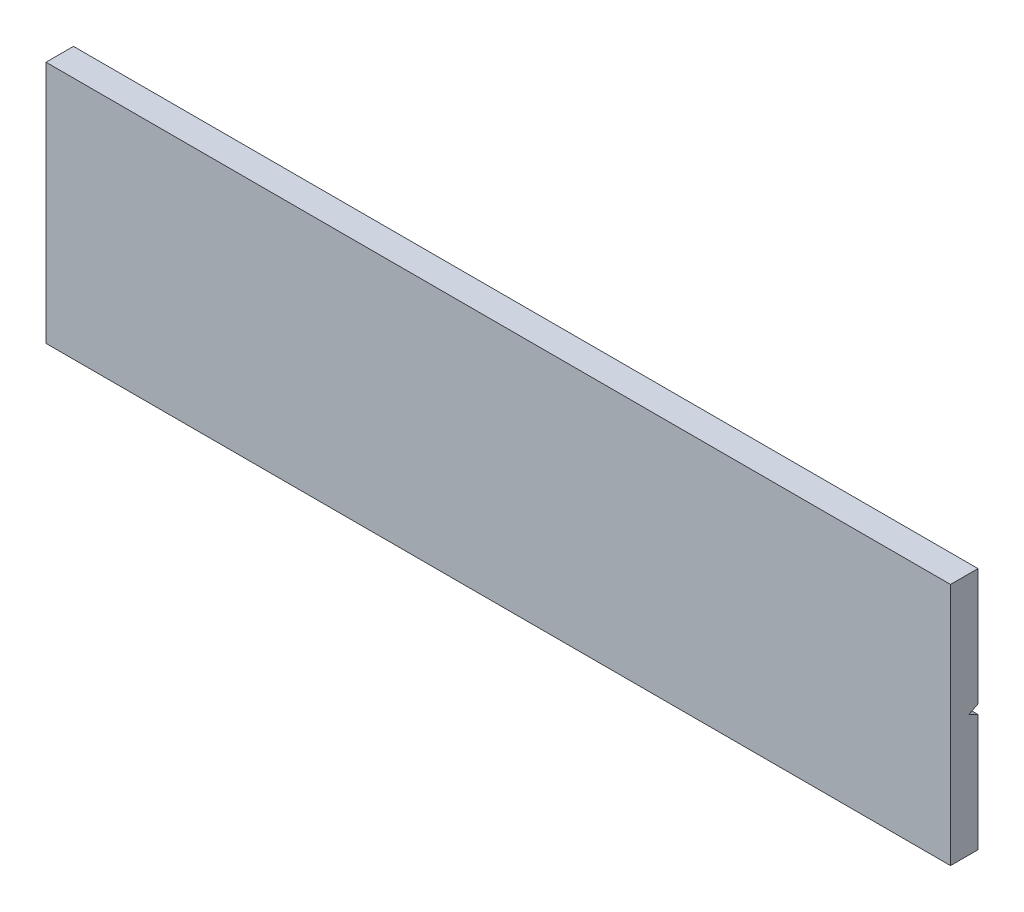
ISO-10303-21;
HEADER;
FILE_DESCRIPTION(('STEP AP214'),'2;1');
FILE_NAME('part.step','',(''),(''),'','','');
FILE_SCHEMA(('AUTOMOTIVE_DESIGN { 1 0 10303 214 1 1 1 1 }'));
ENDSEC;
DATA;
#1=APPLICATION_CONTEXT('core data for automotive mechanical design processes');
#2=APPLICATION_PROTOCOL_DEFINITION('international standard','automotive_design',2000,#1);
#3=PRODUCT_CONTEXT('',#1,'mechanical');
#4=PRODUCT('Part','Part','',(#3));
#5=PRODUCT_RELATED_PRODUCT_CATEGORY('part','',(#4));
#6=PRODUCT_DEFINITION_FORMATION('','',#4);
#7=PRODUCT_DEFINITION_CONTEXT('part definition',#1,'design');
#8=PRODUCT_DEFINITION('design','',#6,#7);
#9=PRODUCT_DEFINITION_SHAPE('','',#8);
#10=(LENGTH_UNIT() NAMED_UNIT(*) SI_UNIT(.MILLI.,.METRE.));
#11=(NAMED_UNIT(*) PLANE_ANGLE_UNIT() SI_UNIT($,.RADIAN.));
#12=(NAMED_UNIT(*) SI_UNIT($,.STERADIAN.) SOLID_ANGLE_UNIT());
#13=UNCERTAINTY_MEASURE_WITH_UNIT(LENGTH_MEASURE(1.E-05),#10,'distance_accuracy_value','');
#14=(GEOMETRIC_REPRESENTATION_CONTEXT(3) GLOBAL_UNCERTAINTY_ASSIGNED_CONTEXT((#13)) GLOBAL_UNIT_ASSIGNED_CONTEXT((#10,
#11,#12)) REPRESENTATION_CONTEXT('',''));
#15=CARTESIAN_POINT('',(0.,0.,0.));
#16=DIRECTION('',(0.,0.,1.));
#17=DIRECTION('',(1.,0.,0.));
#18=AXIS2_PLACEMENT_3D('',#15,#16,#17);
#19=CARTESIAN_POINT('',(-24.7,4.12079139916339,-7.74158279832677));
#20=DIRECTION('',(0.,-0.894427190999916,-0.447213595499958));
#21=DIRECTION('',(0.,0.447213595499958,-0.894427190999916));
#22=AXIS2_PLACEMENT_3D('',#19,#20,#21);
#23=PLANE('',#22);
#24=DIRECTION('',(0.,0.447213595499958,-0.894427190999916));
#25=VECTOR('',#24,1.);
#26=CARTESIAN_POINT('',(-24.7,4.12079139916339,-7.74158279832677));
#27=LINE('',#26,#25);
#28=CARTESIAN_POINT('',(-24.7,0.,0.5));
#29=VERTEX_POINT('',#28);
#30=CARTESIAN_POINT('',(-24.7,0.249999999999999,0.));
#31=VERTEX_POINT('',#30);
#32=EDGE_CURVE('E83',#29,#31,#27,.T.);
#33=ORIENTED_EDGE('',*,*,#32,.T.);
#34=DIRECTION('',(1.,0.,0.));
#35=VECTOR('',#34,1.);
#36=CARTESIAN_POINT('',(24.7,0.249999999999999,0.));
#37=LINE('',#36,#35);
#38=CARTESIAN_POINT('',(24.7,0.249999999999999,0.));
#39=VERTEX_POINT('',#38);
#40=EDGE_CURVE('E78',#31,#39,#37,.T.);
#41=ORIENTED_EDGE('',*,*,#40,.T.);
#42=DIRECTION('',(0.,0.447213595499958,-0.894427190999916));
#43=VECTOR('',#42,1.);
#44=CARTESIAN_POINT('',(24.7,4.12079139916339,-7.74158279832677));
#45=LINE('',#44,#43);
#46=CARTESIAN_POINT('',(24.7,0.,0.5));
#47=VERTEX_POINT('',#46);
#48=EDGE_CURVE('E18',#39,#47,#45,.F.);
#49=ORIENTED_EDGE('',*,*,#48,.T.);
#50=DIRECTION('',(1.,0.,0.));
#51=VECTOR('',#50,1.);
#52=CARTESIAN_POINT('',(-24.7,0.,0.500000000000001));
#53=LINE('',#52,#51);
#54=EDGE_CURVE('E76',#29,#47,#53,.T.);
#55=ORIENTED_EDGE('',*,*,#54,.F.);
#56=EDGE_LOOP('',(#33,#41,#49,#55));
#57=FACE_BOUND('',#56,.T.);
#58=ADVANCED_FACE('F15',(#57),#23,.T.);
#59=CARTESIAN_POINT('',(-24.7,-4.12079139916339,-7.74158279832677));
#60=DIRECTION('',(0.,0.894427190999916,-0.447213595499958));
#61=DIRECTION('',(0.,0.447213595499958,0.894427190999916));
#62=AXIS2_PLACEMENT_3D('',#59,#60,#61);
#63=PLANE('',#62);
#64=DIRECTION('',(0.,0.447213595499958,0.894427190999916));
#65=VECTOR('',#64,1.);
#66=CARTESIAN_POINT('',(-24.7,-4.12079139916339,-7.74158279832677));
#67=LINE('',#66,#65);
#68=CARTESIAN_POINT('',(-24.7,-0.249999999999999,0.));
#69=VERTEX_POINT('',#68);
#70=EDGE_CURVE('E70',#69,#29,#67,.T.);
#71=ORIENTED_EDGE('',*,*,#70,.T.);
#72=ORIENTED_EDGE('',*,*,#54,.T.);
#73=DIRECTION('',(0.,0.447213595499958,0.894427190999916));
#74=VECTOR('',#73,1.);
#75=CARTESIAN_POINT('',(24.7,-4.12079139916339,-7.74158279832677));
#76=LINE('',#75,#74);
#77=CARTESIAN_POINT('',(24.7,-0.25,0.));
#78=VERTEX_POINT('',#77);
#79=EDGE_CURVE('E85',#47,#78,#76,.F.);
#80=ORIENTED_EDGE('',*,*,#79,.T.);
#81=DIRECTION('',(1.,0.,0.));
#82=VECTOR('',#81,1.);
#83=CARTESIAN_POINT('',(24.7,-0.249999999999999,0.));
#84=LINE('',#83,#82);
#85=EDGE_CURVE('E96',#78,#69,#84,.F.);
#86=ORIENTED_EDGE('',*,*,#85,.T.);
#87=EDGE_LOOP('',(#71,#72,#80,#86));
#88=FACE_BOUND('',#87,.T.);
#89=ADVANCED_FACE('F84',(#88),#63,.T.);
#90=CARTESIAN_POINT('',(24.7,-6.65,0.));
#91=DIRECTION('',(0.,0.,1.));
#92=DIRECTION('',(1.,0.,0.));
#93=AXIS2_PLACEMENT_3D('',#90,#91,#92);
#94=PLANE('',#93);
#95=DIRECTION('',(0.,1.,0.));
#96=VECTOR('',#95,1.);
#97=CARTESIAN_POINT('',(-24.7,6.65000000000002,0.));
#98=LINE('',#97,#96);
#99=CARTESIAN_POINT('',(-24.7,6.65000000000001,0.));
#100=VERTEX_POINT('',#99);
#101=EDGE_CURVE('E111',#100,#31,#98,.F.);
#102=ORIENTED_EDGE('',*,*,#101,.F.);
#103=DIRECTION('',(1.,0.,0.));
#104=VECTOR('',#103,1.);
#105=CARTESIAN_POINT('',(24.7,6.65000000000002,0.));
#106=LINE('',#105,#104);
#107=CARTESIAN_POINT('',(24.7,6.65000000000001,0.));
#108=VERTEX_POINT('',#107);
#109=EDGE_CURVE('E98',#100,#108,#106,.T.);
#110=ORIENTED_EDGE('',*,*,#109,.T.);
#111=DIRECTION('',(0.,1.,0.));
#112=VECTOR('',#111,1.);
#113=CARTESIAN_POINT('',(24.7,6.65000000000002,0.));
#114=LINE('',#113,#112);
#115=EDGE_CURVE('E104',#108,#39,#114,.F.);
#116=ORIENTED_EDGE('',*,*,#115,.T.);
#117=ORIENTED_EDGE('',*,*,#40,.F.);
#118=EDGE_LOOP('',(#102,#110,#116,#117));
#119=FACE_BOUND('',#118,.T.);
#120=ADVANCED_FACE('F157',(#119),#94,.F.);
#121=CARTESIAN_POINT('',(24.7,-6.65,0.));
#122=DIRECTION('',(0.,0.,1.));
#123=DIRECTION('',(1.,0.,0.));
#124=AXIS2_PLACEMENT_3D('',#121,#122,#123);
#125=PLANE('',#124);
#126=DIRECTION('',(0.,1.,0.));
#127=VECTOR('',#126,1.);
#128=CARTESIAN_POINT('',(24.7,6.65000000000002,0.));
#129=LINE('',#128,#127);
#130=CARTESIAN_POINT('',(24.7,-6.65,0.));
#131=VERTEX_POINT('',#130);
#132=EDGE_CURVE('E91',#78,#131,#129,.F.);
#133=ORIENTED_EDGE('',*,*,#132,.T.);
#134=DIRECTION('',(1.,0.,0.));
#135=VECTOR('',#134,1.);
#136=CARTESIAN_POINT('',(24.7,-6.65,0.));
#137=LINE('',#136,#135);
#138=CARTESIAN_POINT('',(-24.7,-6.65,0.));
#139=VERTEX_POINT('',#138);
#140=EDGE_CURVE('E108',#131,#139,#137,.F.);
#141=ORIENTED_EDGE('',*,*,#140,.T.);
#142=DIRECTION('',(0.,1.,0.));
#143=VECTOR('',#142,1.);
#144=CARTESIAN_POINT('',(-24.7,6.65000000000002,0.));
#145=LINE('',#144,#143);
#146=EDGE_CURVE('E114',#69,#139,#145,.F.);
#147=ORIENTED_EDGE('',*,*,#146,.F.);
#148=ORIENTED_EDGE('',*,*,#85,.F.);
#149=EDGE_LOOP('',(#133,#141,#147,#148));
#150=FACE_BOUND('',#149,.T.);
#151=ADVANCED_FACE('F154',(#150),#125,.F.);
#152=CARTESIAN_POINT('',(24.7,6.64999999999999,1.5));
#153=DIRECTION('',(0.,-1.,0.));
#154=DIRECTION('',(0.,0.,-1.));
#155=AXIS2_PLACEMENT_3D('',#152,#153,#154);
#156=PLANE('',#155);
#157=DIRECTION('',(-1.,0.,0.));
#158=VECTOR('',#157,1.);
#159=CARTESIAN_POINT('',(24.7,6.64999999999999,1.5));
#160=LINE('',#159,#158);
#161=CARTESIAN_POINT('',(-24.7,6.64999999999999,1.5));
#162=VERTEX_POINT('',#161);
#163=CARTESIAN_POINT('',(24.7,6.64999999999999,1.5));
#164=VERTEX_POINT('',#163);
#165=EDGE_CURVE('E120',#162,#164,#160,.F.);
#166=ORIENTED_EDGE('',*,*,#165,.T.);
#167=DIRECTION('',(0.,0.,1.));
#168=VECTOR('',#167,1.);
#169=CARTESIAN_POINT('',(24.7,6.64999999999999,0.));
#170=LINE('',#169,#168);
#171=EDGE_CURVE('E101',#164,#108,#170,.F.);
#172=ORIENTED_EDGE('',*,*,#171,.T.);
#173=ORIENTED_EDGE('',*,*,#109,.F.);
#174=DIRECTION('',(0.,0.,1.));
#175=VECTOR('',#174,1.);
#176=CARTESIAN_POINT('',(-24.7,6.64999999999999,0.));
#177=LINE('',#176,#175);
#178=EDGE_CURVE('E117',#162,#100,#177,.F.);
#179=ORIENTED_EDGE('',*,*,#178,.F.);
#180=EDGE_LOOP('',(#166,#172,#173,#179));
#181=FACE_BOUND('',#180,.T.);
#182=ADVANCED_FACE('F135',(#181),#156,.F.);
#183=CARTESIAN_POINT('',(24.7,6.65000000000002,0.));
#184=DIRECTION('',(-1.,0.,0.));
#185=DIRECTION('',(0.,0.,1.));
#186=AXIS2_PLACEMENT_3D('',#183,#184,#185);
#187=PLANE('',#186);
#188=ORIENTED_EDGE('',*,*,#115,.F.);
#189=ORIENTED_EDGE('',*,*,#171,.F.);
#190=DIRECTION('',(0.,1.,0.));
#191=VECTOR('',#190,1.);
#192=CARTESIAN_POINT('',(24.7,-6.65000000000001,1.5));
#193=LINE('',#192,#191);
#194=CARTESIAN_POINT('',(24.7,-6.65000000000001,1.5));
#195=VERTEX_POINT('',#194);
#196=EDGE_CURVE('E123',#164,#195,#193,.F.);
#197=ORIENTED_EDGE('',*,*,#196,.T.);
#198=DIRECTION('',(0.,0.,1.));
#199=VECTOR('',#198,1.);
#200=CARTESIAN_POINT('',(24.7,-6.65000000000001,1.5));
#201=LINE('',#200,#199);
#202=EDGE_CURVE('E106',#195,#131,#201,.F.);
#203=ORIENTED_EDGE('',*,*,#202,.T.);
#204=ORIENTED_EDGE('',*,*,#132,.F.);
#205=ORIENTED_EDGE('',*,*,#79,.F.);
#206=ORIENTED_EDGE('',*,*,#48,.F.);
#207=EDGE_LOOP('',(#188,#189,#197,#203,#204,#205,#206));
#208=FACE_BOUND('',#207,.T.);
#209=ADVANCED_FACE('F89',(#208),#187,.F.);
#210=CARTESIAN_POINT('',(24.7,-6.65000000000001,1.5));
#211=DIRECTION('',(0.,1.,0.));
#212=DIRECTION('',(0.,0.,1.));
#213=AXIS2_PLACEMENT_3D('',#210,#211,#212);
#214=PLANE('',#213);
#215=ORIENTED_EDGE('',*,*,#140,.F.);
#216=ORIENTED_EDGE('',*,*,#202,.F.);
#217=DIRECTION('',(-1.,0.,0.));
#218=VECTOR('',#217,1.);
#219=CARTESIAN_POINT('',(24.7,-6.65000000000001,1.5));
#220=LINE('',#219,#218);
#221=CARTESIAN_POINT('',(-24.7,-6.65000000000001,1.5));
#222=VERTEX_POINT('',#221);
#223=EDGE_CURVE('E24',#195,#222,#220,.T.);
#224=ORIENTED_EDGE('',*,*,#223,.T.);
#225=DIRECTION('',(0.,0.,1.));
#226=VECTOR('',#225,1.);
#227=CARTESIAN_POINT('',(-24.7,-6.65,0.));
#228=LINE('',#227,#226);
#229=EDGE_CURVE('E32',#139,#222,#228,.T.);
#230=ORIENTED_EDGE('',*,*,#229,.F.);
#231=EDGE_LOOP('',(#215,#216,#224,#230));
#232=FACE_BOUND('',#231,.T.);
#233=ADVANCED_FACE('F130',(#232),#214,.F.);
#234=CARTESIAN_POINT('',(-24.7,6.65000000000002,0.));
#235=DIRECTION('',(-1.,0.,0.));
#236=DIRECTION('',(0.,0.,1.));
#237=AXIS2_PLACEMENT_3D('',#234,#235,#236);
#238=PLANE('',#237);
#239=DIRECTION('',(0.,1.,0.));
#240=VECTOR('',#239,1.);
#241=CARTESIAN_POINT('',(-24.7,-6.65000000000001,1.5));
#242=LINE('',#241,#240);
#243=EDGE_CURVE('E10',#222,#162,#242,.T.);
#244=ORIENTED_EDGE('',*,*,#243,.T.);
#245=ORIENTED_EDGE('',*,*,#178,.T.);
#246=ORIENTED_EDGE('',*,*,#101,.T.);
#247=ORIENTED_EDGE('',*,*,#32,.F.);
#248=ORIENTED_EDGE('',*,*,#70,.F.);
#249=ORIENTED_EDGE('',*,*,#146,.T.);
#250=ORIENTED_EDGE('',*,*,#229,.T.);
#251=EDGE_LOOP('',(#244,#245,#246,#247,#248,#249,#250));
#252=FACE_BOUND('',#251,.T.);
#253=ADVANCED_FACE('F138',(#252),#238,.T.);
#254=CARTESIAN_POINT('',(24.7,-6.65000000000001,1.5));
#255=DIRECTION('',(0.,0.,-1.));
#256=DIRECTION('',(-1.,0.,0.));
#257=AXIS2_PLACEMENT_3D('',#254,#255,#256);
#258=PLANE('',#257);
#259=ORIENTED_EDGE('',*,*,#223,.F.);
#260=ORIENTED_EDGE('',*,*,#196,.F.);
#261=ORIENTED_EDGE('',*,*,#165,.F.);
#262=ORIENTED_EDGE('',*,*,#243,.F.);
#263=EDGE_LOOP('',(#259,#260,#261,#262));
#264=FACE_BOUND('',#263,.T.);
#265=ADVANCED_FACE('F133',(#264),#258,.F.);
#266=CLOSED_SHELL('',(#58,#89,#120,#151,#182,#209,#233,#253,#265));
#267=MANIFOLD_SOLID_BREP('B1',#266);
#268=ADVANCED_BREP_SHAPE_REPRESENTATION('',(#18,#267),#14);
#269=SHAPE_DEFINITION_REPRESENTATION(#9,#268);
ENDSEC;
END-ISO-10303-21;
